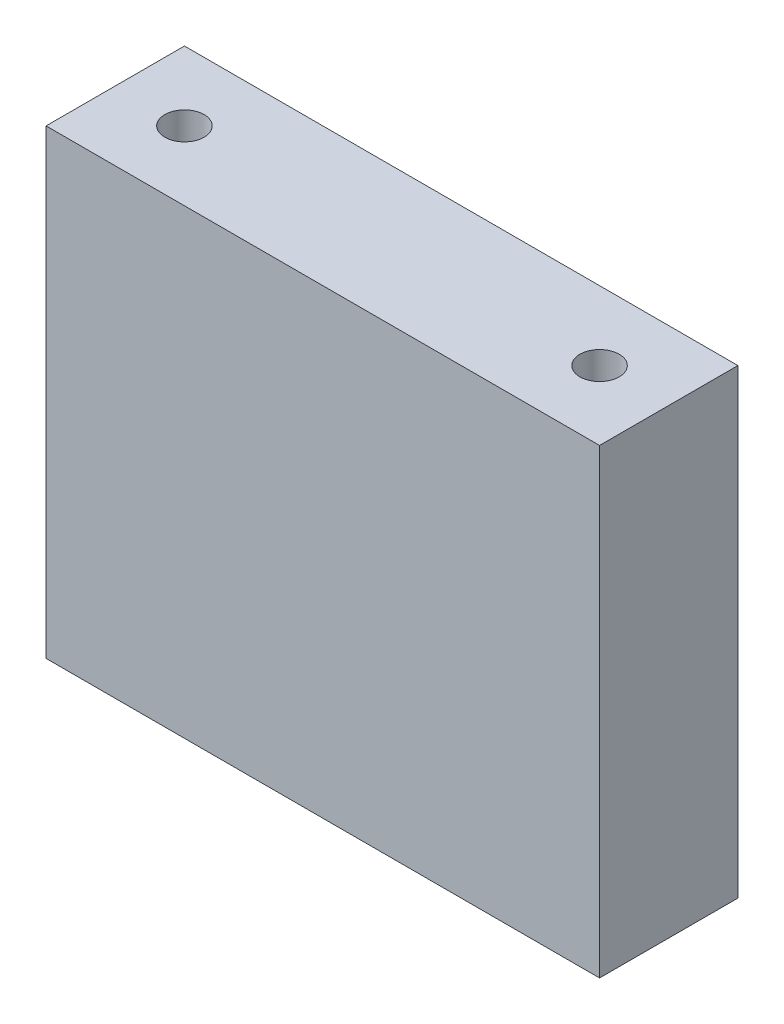
ISO-10303-21;
HEADER;
FILE_DESCRIPTION(('STEP AP214'),'2;1');
FILE_NAME('part.step','',(''),(''),'','','');
FILE_SCHEMA(('AUTOMOTIVE_DESIGN { 1 0 10303 214 1 1 1 1 }'));
ENDSEC;
DATA;
#1=APPLICATION_CONTEXT('core data for automotive mechanical design processes');
#2=APPLICATION_PROTOCOL_DEFINITION('international standard','automotive_design',2000,#1);
#3=PRODUCT_CONTEXT('',#1,'mechanical');
#4=PRODUCT('Part','Part','',(#3));
#5=PRODUCT_RELATED_PRODUCT_CATEGORY('part','',(#4));
#6=PRODUCT_DEFINITION_FORMATION('','',#4);
#7=PRODUCT_DEFINITION_CONTEXT('part definition',#1,'design');
#8=PRODUCT_DEFINITION('design','',#6,#7);
#9=PRODUCT_DEFINITION_SHAPE('','',#8);
#10=(LENGTH_UNIT() NAMED_UNIT(*) SI_UNIT(.MILLI.,.METRE.));
#11=(NAMED_UNIT(*) PLANE_ANGLE_UNIT() SI_UNIT($,.RADIAN.));
#12=(NAMED_UNIT(*) SI_UNIT($,.STERADIAN.) SOLID_ANGLE_UNIT());
#13=UNCERTAINTY_MEASURE_WITH_UNIT(LENGTH_MEASURE(1.E-05),#10,'distance_accuracy_value','');
#14=(GEOMETRIC_REPRESENTATION_CONTEXT(3) GLOBAL_UNCERTAINTY_ASSIGNED_CONTEXT((#13)) GLOBAL_UNIT_ASSIGNED_CONTEXT((#10,
#11,#12)) REPRESENTATION_CONTEXT('',''));
#15=CARTESIAN_POINT('',(0.,0.,0.));
#16=DIRECTION('',(0.,0.,1.));
#17=DIRECTION('',(1.,0.,0.));
#18=AXIS2_PLACEMENT_3D('',#15,#16,#17);
#19=CARTESIAN_POINT('',(19.05,15.875,9.525));
#20=DIRECTION('',(-1.,0.,0.));
#21=DIRECTION('',(0.,-1.,0.));
#22=AXIS2_PLACEMENT_3D('',#19,#20,#21);
#23=PLANE('',#22);
#24=DIRECTION('',(0.,1.,0.));
#25=VECTOR('',#24,1.);
#26=CARTESIAN_POINT('',(19.05,15.875,0.));
#27=LINE('',#26,#25);
#28=CARTESIAN_POINT('',(19.05,-15.875,0.));
#29=VERTEX_POINT('',#28);
#30=CARTESIAN_POINT('',(19.05,15.875,0.));
#31=VERTEX_POINT('',#30);
#32=EDGE_CURVE('E151',#29,#31,#27,.T.);
#33=ORIENTED_EDGE('',*,*,#32,.T.);
#34=DIRECTION('',(0.,0.,-1.));
#35=VECTOR('',#34,1.);
#36=CARTESIAN_POINT('',(19.05,15.875,9.525));
#37=LINE('',#36,#35);
#38=CARTESIAN_POINT('',(19.05,15.875,9.525));
#39=VERTEX_POINT('',#38);
#40=EDGE_CURVE('E11',#39,#31,#37,.T.);
#41=ORIENTED_EDGE('',*,*,#40,.F.);
#42=DIRECTION('',(0.,1.,0.));
#43=VECTOR('',#42,1.);
#44=CARTESIAN_POINT('',(19.05,15.875,9.525));
#45=LINE('',#44,#43);
#46=CARTESIAN_POINT('',(19.05,-15.875,9.525));
#47=VERTEX_POINT('',#46);
#48=EDGE_CURVE('E152',#47,#39,#45,.T.);
#49=ORIENTED_EDGE('',*,*,#48,.F.);
#50=DIRECTION('',(0.,0.,-1.));
#51=VECTOR('',#50,1.);
#52=CARTESIAN_POINT('',(19.05,-15.875,9.525));
#53=LINE('',#52,#51);
#54=EDGE_CURVE('E162',#47,#29,#53,.T.);
#55=ORIENTED_EDGE('',*,*,#54,.T.);
#56=EDGE_LOOP('',(#33,#41,#49,#55));
#57=FACE_BOUND('',#56,.T.);
#58=ADVANCED_FACE('F49',(#57),#23,.F.);
#59=CARTESIAN_POINT('',(-19.05,15.875,9.525));
#60=DIRECTION('',(0.,-1.,0.));
#61=DIRECTION('',(0.,0.,-1.));
#62=AXIS2_PLACEMENT_3D('',#59,#60,#61);
#63=PLANE('',#62);
#64=CARTESIAN_POINT('',(-14.2875,15.875,4.7625));
#65=DIRECTION('',(0.,1.,0.));
#66=DIRECTION('',(0.,0.,1.));
#67=AXIS2_PLACEMENT_3D('',#64,#65,#66);
#68=CIRCLE('',#67,1.35254999999999);
#69=CARTESIAN_POINT('',(-14.2875,15.875,6.11504999999999));
#70=VERTEX_POINT('',#69);
#71=EDGE_CURVE('E135',#70,#70,#68,.T.);
#72=ORIENTED_EDGE('',*,*,#71,.F.);
#73=EDGE_LOOP('',(#72));
#74=FACE_BOUND('',#73,.T.);
#75=CARTESIAN_POINT('',(14.2875,15.875,4.7625));
#76=DIRECTION('',(0.,1.,0.));
#77=DIRECTION('',(0.,0.,1.));
#78=AXIS2_PLACEMENT_3D('',#75,#76,#77);
#79=CIRCLE('',#78,1.35254999999999);
#80=CARTESIAN_POINT('',(14.2875,15.875,6.11504999999999));
#81=VERTEX_POINT('',#80);
#82=EDGE_CURVE('E143',#81,#81,#79,.T.);
#83=ORIENTED_EDGE('',*,*,#82,.F.);
#84=EDGE_LOOP('',(#83));
#85=FACE_BOUND('',#84,.T.);
#86=DIRECTION('',(-1.,0.,0.));
#87=VECTOR('',#86,1.);
#88=CARTESIAN_POINT('',(-19.05,15.875,0.));
#89=LINE('',#88,#87);
#90=CARTESIAN_POINT('',(-19.05,15.875,0.));
#91=VERTEX_POINT('',#90);
#92=EDGE_CURVE('E166',#31,#91,#89,.T.);
#93=ORIENTED_EDGE('',*,*,#92,.T.);
#94=DIRECTION('',(0.,0.,-1.));
#95=VECTOR('',#94,1.);
#96=CARTESIAN_POINT('',(-19.05,15.875,9.525));
#97=LINE('',#96,#95);
#98=CARTESIAN_POINT('',(-19.05,15.875,9.525));
#99=VERTEX_POINT('',#98);
#100=EDGE_CURVE('E58',#99,#91,#97,.T.);
#101=ORIENTED_EDGE('',*,*,#100,.F.);
#102=DIRECTION('',(-1.,0.,0.));
#103=VECTOR('',#102,1.);
#104=CARTESIAN_POINT('',(-19.05,15.875,9.525));
#105=LINE('',#104,#103);
#106=EDGE_CURVE('E97',#39,#99,#105,.T.);
#107=ORIENTED_EDGE('',*,*,#106,.F.);
#108=ORIENTED_EDGE('',*,*,#40,.T.);
#109=EDGE_LOOP('',(#93,#101,#107,#108));
#110=FACE_BOUND('',#109,.T.);
#111=ADVANCED_FACE('F196',(#74,#85,#110),#63,.F.);
#112=CARTESIAN_POINT('',(-19.05,15.875,9.525));
#113=DIRECTION('',(1.,0.,0.));
#114=DIRECTION('',(0.,1.,0.));
#115=AXIS2_PLACEMENT_3D('',#112,#113,#114);
#116=PLANE('',#115);
#117=DIRECTION('',(0.,-1.,0.));
#118=VECTOR('',#117,1.);
#119=CARTESIAN_POINT('',(-19.05,15.875,0.));
#120=LINE('',#119,#118);
#121=CARTESIAN_POINT('',(-19.05,-15.875,0.));
#122=VERTEX_POINT('',#121);
#123=EDGE_CURVE('E84',#91,#122,#120,.T.);
#124=ORIENTED_EDGE('',*,*,#123,.T.);
#125=DIRECTION('',(0.,0.,-1.));
#126=VECTOR('',#125,1.);
#127=CARTESIAN_POINT('',(-19.05,-15.875,9.525));
#128=LINE('',#127,#126);
#129=CARTESIAN_POINT('',(-19.05,-15.875,9.525));
#130=VERTEX_POINT('',#129);
#131=EDGE_CURVE('E175',#130,#122,#128,.T.);
#132=ORIENTED_EDGE('',*,*,#131,.F.);
#133=DIRECTION('',(0.,-1.,0.));
#134=VECTOR('',#133,1.);
#135=CARTESIAN_POINT('',(-19.05,15.875,9.525));
#136=LINE('',#135,#134);
#137=EDGE_CURVE('E157',#99,#130,#136,.T.);
#138=ORIENTED_EDGE('',*,*,#137,.F.);
#139=ORIENTED_EDGE('',*,*,#100,.T.);
#140=EDGE_LOOP('',(#124,#132,#138,#139));
#141=FACE_BOUND('',#140,.T.);
#142=ADVANCED_FACE('F179',(#141),#116,.F.);
#143=CARTESIAN_POINT('',(-19.05,-15.875,9.525));
#144=DIRECTION('',(0.,1.,0.));
#145=DIRECTION('',(0.,0.,1.));
#146=AXIS2_PLACEMENT_3D('',#143,#144,#145);
#147=PLANE('',#146);
#148=CARTESIAN_POINT('',(14.2875,-15.875,4.7625));
#149=DIRECTION('',(0.,-1.,0.));
#150=DIRECTION('',(0.,0.,-1.));
#151=AXIS2_PLACEMENT_3D('',#148,#149,#150);
#152=CIRCLE('',#151,1.35254999999999);
#153=CARTESIAN_POINT('',(14.2875,-15.875,3.40995000000001));
#154=VERTEX_POINT('',#153);
#155=EDGE_CURVE('E122',#154,#154,#152,.T.);
#156=ORIENTED_EDGE('',*,*,#155,.F.);
#157=EDGE_LOOP('',(#156));
#158=FACE_BOUND('',#157,.T.);
#159=CARTESIAN_POINT('',(-14.2875,-15.875,4.7625));
#160=DIRECTION('',(0.,-1.,0.));
#161=DIRECTION('',(0.,0.,-1.));
#162=AXIS2_PLACEMENT_3D('',#159,#160,#161);
#163=CIRCLE('',#162,1.35254999999999);
#164=CARTESIAN_POINT('',(-14.2875,-15.875,3.40995000000001));
#165=VERTEX_POINT('',#164);
#166=EDGE_CURVE('E121',#165,#165,#163,.T.);
#167=ORIENTED_EDGE('',*,*,#166,.F.);
#168=EDGE_LOOP('',(#167));
#169=FACE_BOUND('',#168,.T.);
#170=DIRECTION('',(1.,0.,0.));
#171=VECTOR('',#170,1.);
#172=CARTESIAN_POINT('',(-19.05,-15.875,0.));
#173=LINE('',#172,#171);
#174=EDGE_CURVE('E90',#122,#29,#173,.T.);
#175=ORIENTED_EDGE('',*,*,#174,.T.);
#176=ORIENTED_EDGE('',*,*,#54,.F.);
#177=DIRECTION('',(1.,0.,0.));
#178=VECTOR('',#177,1.);
#179=CARTESIAN_POINT('',(-19.05,-15.875,9.525));
#180=LINE('',#179,#178);
#181=EDGE_CURVE('E66',#130,#47,#180,.T.);
#182=ORIENTED_EDGE('',*,*,#181,.F.);
#183=ORIENTED_EDGE('',*,*,#131,.T.);
#184=EDGE_LOOP('',(#175,#176,#182,#183));
#185=FACE_BOUND('',#184,.T.);
#186=ADVANCED_FACE('F186',(#158,#169,#185),#147,.F.);
#187=CARTESIAN_POINT('',(0.,0.,9.525));
#188=DIRECTION('',(0.,0.,1.));
#189=DIRECTION('',(1.,0.,0.));
#190=AXIS2_PLACEMENT_3D('',#187,#188,#189);
#191=PLANE('',#190);
#192=ORIENTED_EDGE('',*,*,#48,.T.);
#193=ORIENTED_EDGE('',*,*,#106,.T.);
#194=ORIENTED_EDGE('',*,*,#137,.T.);
#195=ORIENTED_EDGE('',*,*,#181,.T.);
#196=EDGE_LOOP('',(#192,#193,#194,#195));
#197=FACE_BOUND('',#196,.T.);
#198=ADVANCED_FACE('F188',(#197),#191,.T.);
#199=CARTESIAN_POINT('',(0.,0.,0.));
#200=DIRECTION('',(0.,0.,1.));
#201=DIRECTION('',(1.,0.,0.));
#202=AXIS2_PLACEMENT_3D('',#199,#200,#201);
#203=PLANE('',#202);
#204=ORIENTED_EDGE('',*,*,#32,.F.);
#205=ORIENTED_EDGE('',*,*,#174,.F.);
#206=ORIENTED_EDGE('',*,*,#123,.F.);
#207=ORIENTED_EDGE('',*,*,#92,.F.);
#208=EDGE_LOOP('',(#204,#205,#206,#207));
#209=FACE_BOUND('',#208,.T.);
#210=ADVANCED_FACE('F182',(#209),#203,.F.);
#211=CARTESIAN_POINT('',(14.2875,8.255,4.7625));
#212=DIRECTION('',(0.,1.,0.));
#213=DIRECTION('',(0.,0.,1.));
#214=AXIS2_PLACEMENT_3D('',#211,#212,#213);
#215=CONICAL_SURFACE('',#214,1.35255,1.02974425867665);
#216=CARTESIAN_POINT('',(14.2875,7.44230596973427,4.7625));
#217=VERTEX_POINT('',#216);
#218=VERTEX_LOOP('',#217);
#219=FACE_BOUND('',#218,.T.);
#220=CARTESIAN_POINT('',(14.2875,8.255,4.7625));
#221=DIRECTION('',(0.,1.,0.));
#222=DIRECTION('',(0.,0.,1.));
#223=AXIS2_PLACEMENT_3D('',#220,#221,#222);
#224=CIRCLE('',#223,1.35255);
#225=CARTESIAN_POINT('',(14.2875,8.255,6.11505));
#226=VERTEX_POINT('',#225);
#227=EDGE_CURVE('E147',#226,#226,#224,.T.);
#228=ORIENTED_EDGE('',*,*,#227,.T.);
#229=EDGE_LOOP('',(#228));
#230=FACE_BOUND('',#229,.T.);
#231=ADVANCED_FACE('F215',(#219,#230),#215,.F.);
#232=CARTESIAN_POINT('',(14.2875,15.875,4.7625));
#233=DIRECTION('',(0.,1.,0.));
#234=DIRECTION('',(0.,0.,1.));
#235=AXIS2_PLACEMENT_3D('',#232,#233,#234);
#236=CYLINDRICAL_SURFACE('',#235,1.35254999999999);
#237=ORIENTED_EDGE('',*,*,#227,.F.);
#238=EDGE_LOOP('',(#237));
#239=FACE_BOUND('',#238,.T.);
#240=ORIENTED_EDGE('',*,*,#82,.T.);
#241=EDGE_LOOP('',(#240));
#242=FACE_BOUND('',#241,.T.);
#243=ADVANCED_FACE('F212',(#239,#242),#236,.F.);
#244=CARTESIAN_POINT('',(-14.2875,8.255,4.7625));
#245=DIRECTION('',(0.,1.,0.));
#246=DIRECTION('',(0.,0.,1.));
#247=AXIS2_PLACEMENT_3D('',#244,#245,#246);
#248=CONICAL_SURFACE('',#247,1.35255,1.02974425867665);
#249=CARTESIAN_POINT('',(-14.2875,7.44230596973427,4.7625));
#250=VERTEX_POINT('',#249);
#251=VERTEX_LOOP('',#250);
#252=FACE_BOUND('',#251,.T.);
#253=CARTESIAN_POINT('',(-14.2875,8.255,4.7625));
#254=DIRECTION('',(0.,1.,0.));
#255=DIRECTION('',(0.,0.,1.));
#256=AXIS2_PLACEMENT_3D('',#253,#254,#255);
#257=CIRCLE('',#256,1.35255);
#258=CARTESIAN_POINT('',(-14.2875,8.255,6.11505));
#259=VERTEX_POINT('',#258);
#260=EDGE_CURVE('E139',#259,#259,#257,.T.);
#261=ORIENTED_EDGE('',*,*,#260,.T.);
#262=EDGE_LOOP('',(#261));
#263=FACE_BOUND('',#262,.T.);
#264=ADVANCED_FACE('F214',(#252,#263),#248,.F.);
#265=CARTESIAN_POINT('',(-14.2875,15.875,4.7625));
#266=DIRECTION('',(0.,1.,0.));
#267=DIRECTION('',(0.,0.,1.));
#268=AXIS2_PLACEMENT_3D('',#265,#266,#267);
#269=CYLINDRICAL_SURFACE('',#268,1.35254999999999);
#270=ORIENTED_EDGE('',*,*,#260,.F.);
#271=EDGE_LOOP('',(#270));
#272=FACE_BOUND('',#271,.T.);
#273=ORIENTED_EDGE('',*,*,#71,.T.);
#274=EDGE_LOOP('',(#273));
#275=FACE_BOUND('',#274,.T.);
#276=ADVANCED_FACE('F222',(#272,#275),#269,.F.);
#277=CARTESIAN_POINT('',(-14.2875,-6.48716,4.7625));
#278=DIRECTION('',(0.,-1.,0.));
#279=DIRECTION('',(0.,0.,-1.));
#280=AXIS2_PLACEMENT_3D('',#277,#278,#279);
#281=CONICAL_SURFACE('',#280,1.35255,1.02974425867665);
#282=CARTESIAN_POINT('',(-14.2875,-5.67446596973427,4.7625));
#283=VERTEX_POINT('',#282);
#284=VERTEX_LOOP('',#283);
#285=FACE_BOUND('',#284,.T.);
#286=CARTESIAN_POINT('',(-14.2875,-6.48716,4.7625));
#287=DIRECTION('',(0.,-1.,0.));
#288=DIRECTION('',(0.,0.,-1.));
#289=AXIS2_PLACEMENT_3D('',#286,#287,#288);
#290=CIRCLE('',#289,1.35255);
#291=CARTESIAN_POINT('',(-14.2875,-6.48716,3.40995));
#292=VERTEX_POINT('',#291);
#293=EDGE_CURVE('E127',#292,#292,#290,.T.);
#294=ORIENTED_EDGE('',*,*,#293,.T.);
#295=EDGE_LOOP('',(#294));
#296=FACE_BOUND('',#295,.T.);
#297=ADVANCED_FACE('F269',(#285,#296),#281,.F.);
#298=CARTESIAN_POINT('',(-14.2875,-15.875,4.7625));
#299=DIRECTION('',(0.,-1.,0.));
#300=DIRECTION('',(0.,0.,-1.));
#301=AXIS2_PLACEMENT_3D('',#298,#299,#300);
#302=CYLINDRICAL_SURFACE('',#301,1.35254999999999);
#303=ORIENTED_EDGE('',*,*,#293,.F.);
#304=EDGE_LOOP('',(#303));
#305=FACE_BOUND('',#304,.T.);
#306=ORIENTED_EDGE('',*,*,#166,.T.);
#307=EDGE_LOOP('',(#306));
#308=FACE_BOUND('',#307,.T.);
#309=ADVANCED_FACE('F114',(#305,#308),#302,.F.);
#310=CARTESIAN_POINT('',(14.2875,-6.48716,4.7625));
#311=DIRECTION('',(0.,-1.,0.));
#312=DIRECTION('',(0.,0.,-1.));
#313=AXIS2_PLACEMENT_3D('',#310,#311,#312);
#314=CONICAL_SURFACE('',#313,1.35255,1.02974425867665);
#315=CARTESIAN_POINT('',(14.2875,-5.67446596973427,4.7625));
#316=VERTEX_POINT('',#315);
#317=VERTEX_LOOP('',#316);
#318=FACE_BOUND('',#317,.T.);
#319=CARTESIAN_POINT('',(14.2875,-6.48716,4.7625));
#320=DIRECTION('',(0.,-1.,0.));
#321=DIRECTION('',(0.,0.,-1.));
#322=AXIS2_PLACEMENT_3D('',#319,#320,#321);
#323=CIRCLE('',#322,1.35255);
#324=CARTESIAN_POINT('',(14.2875,-6.48716,3.40995));
#325=VERTEX_POINT('',#324);
#326=EDGE_CURVE('E118',#325,#325,#323,.T.);
#327=ORIENTED_EDGE('',*,*,#326,.T.);
#328=EDGE_LOOP('',(#327));
#329=FACE_BOUND('',#328,.T.);
#330=ADVANCED_FACE('F110',(#318,#329),#314,.F.);
#331=CARTESIAN_POINT('',(14.2875,-15.875,4.7625));
#332=DIRECTION('',(0.,-1.,0.));
#333=DIRECTION('',(0.,0.,-1.));
#334=AXIS2_PLACEMENT_3D('',#331,#332,#333);
#335=CYLINDRICAL_SURFACE('',#334,1.35254999999999);
#336=ORIENTED_EDGE('',*,*,#326,.F.);
#337=EDGE_LOOP('',(#336));
#338=FACE_BOUND('',#337,.T.);
#339=ORIENTED_EDGE('',*,*,#155,.T.);
#340=EDGE_LOOP('',(#339));
#341=FACE_BOUND('',#340,.T.);
#342=ADVANCED_FACE('F113',(#338,#341),#335,.F.);
#343=CLOSED_SHELL('',(#58,#111,#142,#186,#198,#210,#231,#243,#264,#276,#297,#309,#330,#342));
#344=MANIFOLD_SOLID_BREP('B2',#343);
#345=ADVANCED_BREP_SHAPE_REPRESENTATION('',(#18,#344),#14);
#346=SHAPE_DEFINITION_REPRESENTATION(#9,#345);
ENDSEC;
END-ISO-10303-21;
